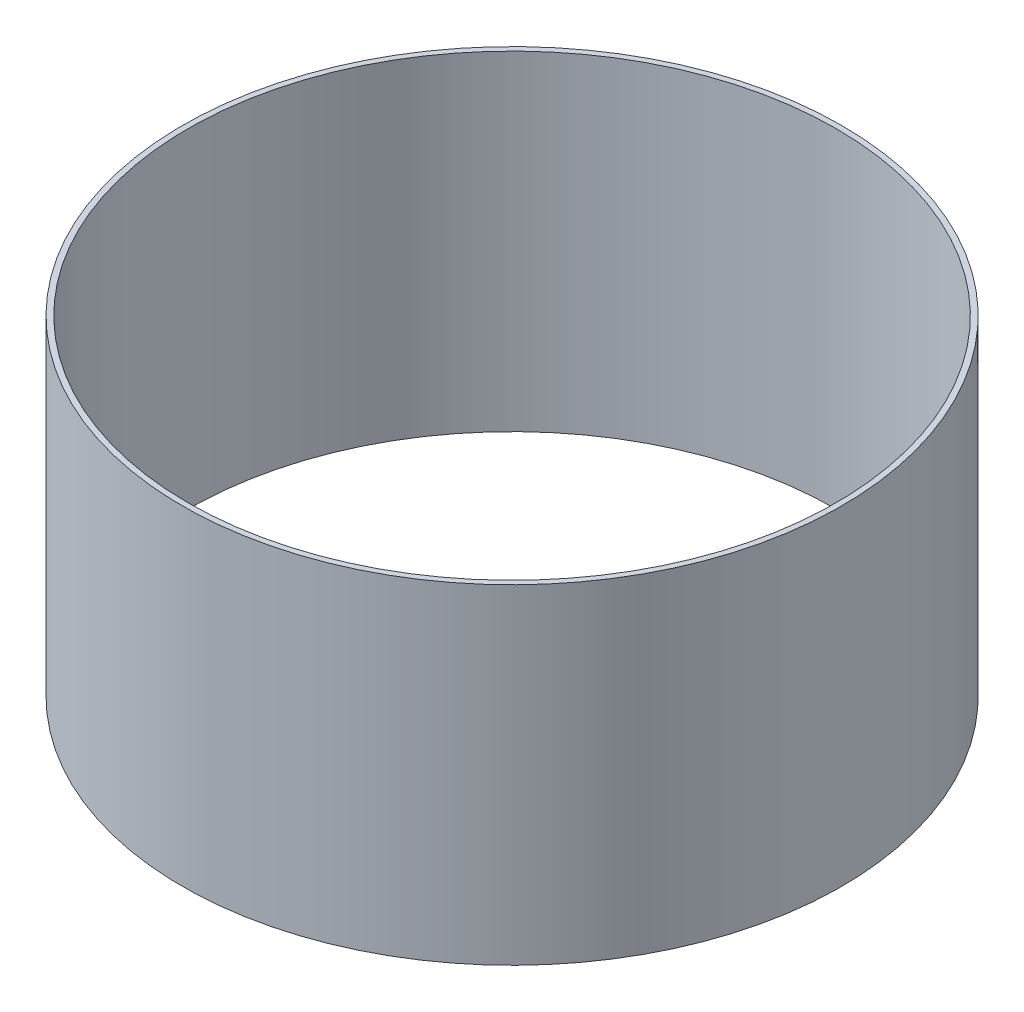
ISO-10303-21;
HEADER;
FILE_DESCRIPTION(('STEP AP214'),'2;1');
FILE_NAME('part.step','',(''),(''),'','','');
FILE_SCHEMA(('AUTOMOTIVE_DESIGN { 1 0 10303 214 1 1 1 1 }'));
ENDSEC;
DATA;
#1=APPLICATION_CONTEXT('core data for automotive mechanical design processes');
#2=APPLICATION_PROTOCOL_DEFINITION('international standard','automotive_design',2000,#1);
#3=PRODUCT_CONTEXT('',#1,'mechanical');
#4=PRODUCT('Part','Part','',(#3));
#5=PRODUCT_RELATED_PRODUCT_CATEGORY('part','',(#4));
#6=PRODUCT_DEFINITION_FORMATION('','',#4);
#7=PRODUCT_DEFINITION_CONTEXT('part definition',#1,'design');
#8=PRODUCT_DEFINITION('design','',#6,#7);
#9=PRODUCT_DEFINITION_SHAPE('','',#8);
#10=(LENGTH_UNIT() NAMED_UNIT(*) SI_UNIT(.MILLI.,.METRE.));
#11=(NAMED_UNIT(*) PLANE_ANGLE_UNIT() SI_UNIT($,.RADIAN.));
#12=(NAMED_UNIT(*) SI_UNIT($,.STERADIAN.) SOLID_ANGLE_UNIT());
#13=UNCERTAINTY_MEASURE_WITH_UNIT(LENGTH_MEASURE(1.E-05),#10,'distance_accuracy_value','');
#14=(GEOMETRIC_REPRESENTATION_CONTEXT(3) GLOBAL_UNCERTAINTY_ASSIGNED_CONTEXT((#13)) GLOBAL_UNIT_ASSIGNED_CONTEXT((#10,
#11,#12)) REPRESENTATION_CONTEXT('',''));
#15=CARTESIAN_POINT('',(0.,0.,0.));
#16=DIRECTION('',(0.,0.,1.));
#17=DIRECTION('',(1.,0.,0.));
#18=AXIS2_PLACEMENT_3D('',#15,#16,#17);
#19=CARTESIAN_POINT('',(0.,76.2,0.));
#20=DIRECTION('',(0.,1.,0.));
#21=DIRECTION('',(0.,0.,1.));
#22=AXIS2_PLACEMENT_3D('',#19,#20,#21);
#23=PLANE('',#22);
#24=CARTESIAN_POINT('',(0.,76.2,0.));
#25=DIRECTION('',(0.,1.,0.));
#26=DIRECTION('',(0.,0.,1.));
#27=AXIS2_PLACEMENT_3D('',#24,#25,#26);
#28=CIRCLE('',#27,76.2);
#29=CARTESIAN_POINT('',(0.,76.2,-76.2));
#30=VERTEX_POINT('',#29);
#31=EDGE_CURVE('E10',#30,#30,#28,.T.);
#32=ORIENTED_EDGE('',*,*,#31,.T.);
#33=EDGE_LOOP('',(#32));
#34=FACE_BOUND('',#33,.T.);
#35=CARTESIAN_POINT('',(0.,76.2,0.));
#36=DIRECTION('',(0.,1.,0.));
#37=DIRECTION('',(0.,0.,1.));
#38=AXIS2_PLACEMENT_3D('',#35,#36,#37);
#39=CIRCLE('',#38,74.93);
#40=CARTESIAN_POINT('',(0.,76.2,-74.93));
#41=VERTEX_POINT('',#40);
#42=EDGE_CURVE('E42',#41,#41,#39,.T.);
#43=ORIENTED_EDGE('',*,*,#42,.F.);
#44=EDGE_LOOP('',(#43));
#45=FACE_BOUND('',#44,.T.);
#46=ADVANCED_FACE('F31',(#34,#45),#23,.T.);
#47=CARTESIAN_POINT('',(0.,0.,0.));
#48=DIRECTION('',(0.,1.,0.));
#49=DIRECTION('',(0.,0.,1.));
#50=AXIS2_PLACEMENT_3D('',#47,#48,#49);
#51=PLANE('',#50);
#52=CARTESIAN_POINT('',(0.,0.,0.));
#53=DIRECTION('',(0.,1.,0.));
#54=DIRECTION('',(0.,0.,1.));
#55=AXIS2_PLACEMENT_3D('',#52,#53,#54);
#56=CIRCLE('',#55,76.2);
#57=CARTESIAN_POINT('',(0.,0.,-76.2));
#58=VERTEX_POINT('',#57);
#59=EDGE_CURVE('E35',#58,#58,#56,.T.);
#60=ORIENTED_EDGE('',*,*,#59,.F.);
#61=EDGE_LOOP('',(#60));
#62=FACE_BOUND('',#61,.T.);
#63=CARTESIAN_POINT('',(0.,0.,0.));
#64=DIRECTION('',(0.,1.,0.));
#65=DIRECTION('',(0.,0.,1.));
#66=AXIS2_PLACEMENT_3D('',#63,#64,#65);
#67=CIRCLE('',#66,74.93);
#68=CARTESIAN_POINT('',(0.,0.,-74.93));
#69=VERTEX_POINT('',#68);
#70=EDGE_CURVE('E44',#69,#69,#67,.T.);
#71=ORIENTED_EDGE('',*,*,#70,.T.);
#72=EDGE_LOOP('',(#71));
#73=FACE_BOUND('',#72,.T.);
#74=ADVANCED_FACE('F54',(#62,#73),#51,.F.);
#75=CARTESIAN_POINT('',(0.,76.2,0.));
#76=DIRECTION('',(0.,-1.,0.));
#77=DIRECTION('',(0.,0.,-1.));
#78=AXIS2_PLACEMENT_3D('',#75,#76,#77);
#79=CYLINDRICAL_SURFACE('',#78,76.2);
#80=CARTESIAN_POINT('',(0.,76.2,-76.2));
#81=CARTESIAN_POINT('',(0.,75.40625,-76.2));
#82=CARTESIAN_POINT('',(0.,74.6125,-76.2));
#83=CARTESIAN_POINT('',(0.,73.025,-76.2));
#84=CARTESIAN_POINT('',(0.,72.23125,-76.2));
#85=CARTESIAN_POINT('',(0.,70.64375,-76.2));
#86=CARTESIAN_POINT('',(0.,69.85,-76.2));
#87=CARTESIAN_POINT('',(0.,68.2625,-76.2));
#88=CARTESIAN_POINT('',(0.,67.46875,-76.2));
#89=CARTESIAN_POINT('',(0.,65.88125,-76.2));
#90=CARTESIAN_POINT('',(0.,65.0875,-76.2));
#91=CARTESIAN_POINT('',(0.,63.5,-76.2));
#92=CARTESIAN_POINT('',(0.,62.70625,-76.2));
#93=CARTESIAN_POINT('',(0.,61.11875,-76.2));
#94=CARTESIAN_POINT('',(0.,60.325,-76.2));
#95=CARTESIAN_POINT('',(0.,58.7375,-76.2));
#96=CARTESIAN_POINT('',(0.,57.94375,-76.2));
#97=CARTESIAN_POINT('',(0.,56.35625,-76.2));
#98=CARTESIAN_POINT('',(0.,55.5625,-76.2));
#99=CARTESIAN_POINT('',(0.,53.975,-76.2));
#100=CARTESIAN_POINT('',(0.,53.18125,-76.2));
#101=CARTESIAN_POINT('',(0.,51.59375,-76.2));
#102=CARTESIAN_POINT('',(0.,50.8,-76.2));
#103=CARTESIAN_POINT('',(0.,49.2125,-76.2));
#104=CARTESIAN_POINT('',(0.,48.41875,-76.2));
#105=CARTESIAN_POINT('',(0.,46.83125,-76.2));
#106=CARTESIAN_POINT('',(0.,46.0375,-76.2));
#107=CARTESIAN_POINT('',(0.,44.45,-76.2));
#108=CARTESIAN_POINT('',(0.,43.65625,-76.2));
#109=CARTESIAN_POINT('',(0.,42.06875,-76.2));
#110=CARTESIAN_POINT('',(0.,41.275,-76.2));
#111=CARTESIAN_POINT('',(0.,39.6875,-76.2));
#112=CARTESIAN_POINT('',(0.,38.89375,-76.2));
#113=CARTESIAN_POINT('',(0.,37.30625,-76.2));
#114=CARTESIAN_POINT('',(0.,36.5125,-76.2));
#115=CARTESIAN_POINT('',(0.,34.925,-76.2));
#116=CARTESIAN_POINT('',(0.,34.13125,-76.2));
#117=CARTESIAN_POINT('',(0.,32.54375,-76.2));
#118=CARTESIAN_POINT('',(0.,31.75,-76.2));
#119=CARTESIAN_POINT('',(0.,30.1625,-76.2));
#120=CARTESIAN_POINT('',(0.,29.36875,-76.2));
#121=CARTESIAN_POINT('',(0.,27.78125,-76.2));
#122=CARTESIAN_POINT('',(0.,26.9875,-76.2));
#123=CARTESIAN_POINT('',(0.,25.4,-76.2));
#124=CARTESIAN_POINT('',(0.,24.60625,-76.2));
#125=CARTESIAN_POINT('',(0.,23.01875,-76.2));
#126=CARTESIAN_POINT('',(0.,22.225,-76.2));
#127=CARTESIAN_POINT('',(0.,20.6375,-76.2));
#128=CARTESIAN_POINT('',(0.,19.84375,-76.2));
#129=CARTESIAN_POINT('',(0.,18.25625,-76.2));
#130=CARTESIAN_POINT('',(0.,17.4625,-76.2));
#131=CARTESIAN_POINT('',(0.,15.875,-76.2));
#132=CARTESIAN_POINT('',(0.,15.08125,-76.2));
#133=CARTESIAN_POINT('',(0.,13.49375,-76.2));
#134=CARTESIAN_POINT('',(0.,12.7,-76.2));
#135=CARTESIAN_POINT('',(0.,11.1125,-76.2));
#136=CARTESIAN_POINT('',(0.,10.31875,-76.2));
#137=CARTESIAN_POINT('',(0.,8.73125,-76.2));
#138=CARTESIAN_POINT('',(0.,7.93750000000001,-76.2));
#139=CARTESIAN_POINT('',(0.,6.35,-76.2));
#140=CARTESIAN_POINT('',(0.,5.55625,-76.2));
#141=CARTESIAN_POINT('',(0.,3.96875,-76.2));
#142=CARTESIAN_POINT('',(0.,3.175,-76.2));
#143=CARTESIAN_POINT('',(0.,1.5875,-76.2));
#144=CARTESIAN_POINT('',(0.,0.793750000000001,-76.2));
#145=CARTESIAN_POINT('',(0.,0.,-76.2));
#146=B_SPLINE_CURVE_WITH_KNOTS('',3,(#80,#81,#82,#83,#84,#85,#86,#87,#88,#89,#90,#91,#92,#93,
#94,#95,#96,#97,#98,#99,#100,#101,#102,#103,#104,#105,#106,#107,#108,#109,#110,#111,#112,#113,
#114,#115,#116,#117,#118,#119,#120,#121,#122,#123,#124,#125,#126,#127,#128,#129,#130,#131,#132,
#133,#134,#135,#136,#137,#138,#139,#140,#141,#142,#143,#144,#145),.UNSPECIFIED.,.F.,.F.,(4,2,2,
2,2,2,2,2,2,2,2,2,2,2,2,2,2,2,2,2,2,2,2,2,2,2,2,2,2,2,2,2,4),(0.,2.38125,4.7625,7.14375,
9.52500000000001,11.90625,14.2875,16.66875,19.05,21.43125,23.8125,26.19375,28.575,30.95625,
33.3375,35.71875,38.1,40.48125,42.8625,45.24375,47.625,50.00625,52.3875,54.76875,57.15,59.53125,
61.9125,64.29375,66.675,69.05625,71.4375,73.81875,76.2),.UNSPECIFIED.);
#147=EDGE_CURVE('BSEAM33',#30,#58,#146,.T.);
#148=ORIENTED_EDGE('',*,*,#31,.F.);
#149=ORIENTED_EDGE('',*,*,#59,.T.);
#150=ORIENTED_EDGE('',*,*,#147,.T.);
#151=ORIENTED_EDGE('',*,*,#147,.F.);
#152=EDGE_LOOP('',(#148,#150,#149,#151));
#153=FACE_BOUND('',#152,.T.);
#154=ADVANCED_FACE('F33',(#153),#79,.T.);
#155=CARTESIAN_POINT('',(0.,76.2,0.));
#156=DIRECTION('',(0.,-1.,0.));
#157=DIRECTION('',(0.,0.,-1.));
#158=AXIS2_PLACEMENT_3D('',#155,#156,#157);
#159=CYLINDRICAL_SURFACE('',#158,74.93);
#160=CARTESIAN_POINT('',(0.,76.2,-74.93));
#161=CARTESIAN_POINT('',(0.,75.40625,-74.93));
#162=CARTESIAN_POINT('',(0.,74.6125,-74.93));
#163=CARTESIAN_POINT('',(0.,73.025,-74.93));
#164=CARTESIAN_POINT('',(0.,72.23125,-74.93));
#165=CARTESIAN_POINT('',(0.,70.64375,-74.93));
#166=CARTESIAN_POINT('',(0.,69.85,-74.93));
#167=CARTESIAN_POINT('',(0.,68.2625,-74.93));
#168=CARTESIAN_POINT('',(0.,67.46875,-74.93));
#169=CARTESIAN_POINT('',(0.,65.88125,-74.93));
#170=CARTESIAN_POINT('',(0.,65.0875,-74.93));
#171=CARTESIAN_POINT('',(0.,63.5,-74.93));
#172=CARTESIAN_POINT('',(0.,62.70625,-74.93));
#173=CARTESIAN_POINT('',(0.,61.11875,-74.93));
#174=CARTESIAN_POINT('',(0.,60.325,-74.93));
#175=CARTESIAN_POINT('',(0.,58.7375,-74.93));
#176=CARTESIAN_POINT('',(0.,57.94375,-74.93));
#177=CARTESIAN_POINT('',(0.,56.35625,-74.93));
#178=CARTESIAN_POINT('',(0.,55.5625,-74.93));
#179=CARTESIAN_POINT('',(0.,53.975,-74.93));
#180=CARTESIAN_POINT('',(0.,53.18125,-74.93));
#181=CARTESIAN_POINT('',(0.,51.59375,-74.93));
#182=CARTESIAN_POINT('',(0.,50.8,-74.93));
#183=CARTESIAN_POINT('',(0.,49.2125,-74.93));
#184=CARTESIAN_POINT('',(0.,48.41875,-74.93));
#185=CARTESIAN_POINT('',(0.,46.83125,-74.93));
#186=CARTESIAN_POINT('',(0.,46.0375,-74.93));
#187=CARTESIAN_POINT('',(0.,44.45,-74.93));
#188=CARTESIAN_POINT('',(0.,43.65625,-74.93));
#189=CARTESIAN_POINT('',(0.,42.06875,-74.93));
#190=CARTESIAN_POINT('',(0.,41.275,-74.93));
#191=CARTESIAN_POINT('',(0.,39.6875,-74.93));
#192=CARTESIAN_POINT('',(0.,38.89375,-74.93));
#193=CARTESIAN_POINT('',(0.,37.30625,-74.93));
#194=CARTESIAN_POINT('',(0.,36.5125,-74.93));
#195=CARTESIAN_POINT('',(0.,34.925,-74.93));
#196=CARTESIAN_POINT('',(0.,34.13125,-74.93));
#197=CARTESIAN_POINT('',(0.,32.54375,-74.93));
#198=CARTESIAN_POINT('',(0.,31.75,-74.93));
#199=CARTESIAN_POINT('',(0.,30.1625,-74.93));
#200=CARTESIAN_POINT('',(0.,29.36875,-74.93));
#201=CARTESIAN_POINT('',(0.,27.78125,-74.93));
#202=CARTESIAN_POINT('',(0.,26.9875,-74.93));
#203=CARTESIAN_POINT('',(0.,25.4,-74.93));
#204=CARTESIAN_POINT('',(0.,24.60625,-74.93));
#205=CARTESIAN_POINT('',(0.,23.01875,-74.93));
#206=CARTESIAN_POINT('',(0.,22.225,-74.93));
#207=CARTESIAN_POINT('',(0.,20.6375,-74.93));
#208=CARTESIAN_POINT('',(0.,19.84375,-74.93));
#209=CARTESIAN_POINT('',(0.,18.25625,-74.93));
#210=CARTESIAN_POINT('',(0.,17.4625,-74.93));
#211=CARTESIAN_POINT('',(0.,15.875,-74.93));
#212=CARTESIAN_POINT('',(0.,15.08125,-74.93));
#213=CARTESIAN_POINT('',(0.,13.49375,-74.93));
#214=CARTESIAN_POINT('',(0.,12.7,-74.93));
#215=CARTESIAN_POINT('',(0.,11.1125,-74.93));
#216=CARTESIAN_POINT('',(0.,10.31875,-74.93));
#217=CARTESIAN_POINT('',(0.,8.73125,-74.93));
#218=CARTESIAN_POINT('',(0.,7.93750000000001,-74.93));
#219=CARTESIAN_POINT('',(0.,6.35,-74.93));
#220=CARTESIAN_POINT('',(0.,5.55625,-74.93));
#221=CARTESIAN_POINT('',(0.,3.96875,-74.93));
#222=CARTESIAN_POINT('',(0.,3.175,-74.93));
#223=CARTESIAN_POINT('',(0.,1.5875,-74.93));
#224=CARTESIAN_POINT('',(0.,0.793750000000001,-74.93));
#225=CARTESIAN_POINT('',(0.,0.,-74.93));
#226=B_SPLINE_CURVE_WITH_KNOTS('',3,(#160,#161,#162,#163,#164,#165,#166,#167,#168,#169,#170,
#171,#172,#173,#174,#175,#176,#177,#178,#179,#180,#181,#182,#183,#184,#185,#186,#187,#188,#189,
#190,#191,#192,#193,#194,#195,#196,#197,#198,#199,#200,#201,#202,#203,#204,#205,#206,#207,#208,
#209,#210,#211,#212,#213,#214,#215,#216,#217,#218,#219,#220,#221,#222,#223,#224,#225),
.UNSPECIFIED.,.F.,.F.,(4,2,2,2,2,2,2,2,2,2,2,2,2,2,2,2,2,2,2,2,2,2,2,2,2,2,2,2,2,2,2,2,4),(0.,
2.38124999999999,4.76249999999999,7.14374999999999,9.52499999999999,11.90625,14.2875,16.66875,
19.05,21.43125,23.8125,26.19375,28.575,30.95625,33.3375,35.71875,38.1,40.48125,42.8625,45.24375,
47.625,50.00625,52.3875,54.76875,57.15,59.53125,61.9125,64.29375,66.675,69.05625,71.4375,
73.81875,76.2),.UNSPECIFIED.);
#227=EDGE_CURVE('BSEAM50',#41,#69,#226,.T.);
#228=ORIENTED_EDGE('',*,*,#42,.T.);
#229=ORIENTED_EDGE('',*,*,#70,.F.);
#230=ORIENTED_EDGE('',*,*,#227,.T.);
#231=ORIENTED_EDGE('',*,*,#227,.F.);
#232=EDGE_LOOP('',(#228,#230,#229,#231));
#233=FACE_BOUND('',#232,.T.);
#234=ADVANCED_FACE('F50',(#233),#159,.F.);
#235=CLOSED_SHELL('',(#46,#74,#154,#234));
#236=MANIFOLD_SOLID_BREP('B2',#235);
#237=ADVANCED_BREP_SHAPE_REPRESENTATION('',(#18,#236),#14);
#238=SHAPE_DEFINITION_REPRESENTATION(#9,#237);
ENDSEC;
END-ISO-10303-21;
